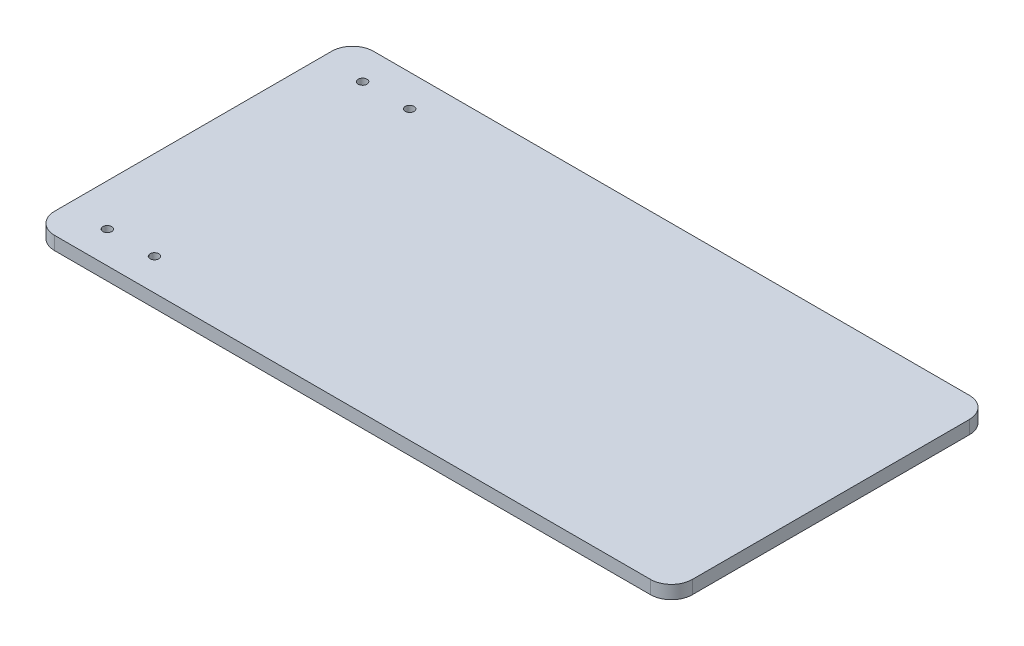
ISO-10303-21;
HEADER;
FILE_DESCRIPTION(('STEP AP214'),'2;1');
FILE_NAME('part.step','',(''),(''),'','','');
FILE_SCHEMA(('AUTOMOTIVE_DESIGN { 1 0 10303 214 1 1 1 1 }'));
ENDSEC;
DATA;
#1=APPLICATION_CONTEXT('core data for automotive mechanical design processes');
#2=APPLICATION_PROTOCOL_DEFINITION('international standard','automotive_design',2000,#1);
#3=PRODUCT_CONTEXT('',#1,'mechanical');
#4=PRODUCT('Part','Part','',(#3));
#5=PRODUCT_RELATED_PRODUCT_CATEGORY('part','',(#4));
#6=PRODUCT_DEFINITION_FORMATION('','',#4);
#7=PRODUCT_DEFINITION_CONTEXT('part definition',#1,'design');
#8=PRODUCT_DEFINITION('design','',#6,#7);
#9=PRODUCT_DEFINITION_SHAPE('','',#8);
#10=(LENGTH_UNIT() NAMED_UNIT(*) SI_UNIT(.MILLI.,.METRE.));
#11=(NAMED_UNIT(*) PLANE_ANGLE_UNIT() SI_UNIT($,.RADIAN.));
#12=(NAMED_UNIT(*) SI_UNIT($,.STERADIAN.) SOLID_ANGLE_UNIT());
#13=UNCERTAINTY_MEASURE_WITH_UNIT(LENGTH_MEASURE(1.E-05),#10,'distance_accuracy_value','');
#14=(GEOMETRIC_REPRESENTATION_CONTEXT(3) GLOBAL_UNCERTAINTY_ASSIGNED_CONTEXT((#13)) GLOBAL_UNIT_ASSIGNED_CONTEXT((#10,
#11,#12)) REPRESENTATION_CONTEXT('',''));
#15=CARTESIAN_POINT('',(0.,0.,0.));
#16=DIRECTION('',(0.,0.,1.));
#17=DIRECTION('',(1.,0.,0.));
#18=AXIS2_PLACEMENT_3D('',#15,#16,#17);
#19=CARTESIAN_POINT('',(-152.4,6.35,-76.2));
#20=DIRECTION('',(1.,0.,0.));
#21=DIRECTION('',(0.,0.,-1.));
#22=AXIS2_PLACEMENT_3D('',#19,#20,#21);
#23=PLANE('',#22);
#24=DIRECTION('',(0.,0.,1.));
#25=VECTOR('',#24,1.);
#26=CARTESIAN_POINT('',(-152.4,6.35,-76.2));
#27=LINE('',#26,#25);
#28=CARTESIAN_POINT('',(-152.4,6.35,-66.2));
#29=VERTEX_POINT('',#28);
#30=CARTESIAN_POINT('',(-152.4,6.35,66.2));
#31=VERTEX_POINT('',#30);
#32=EDGE_CURVE('E121',#29,#31,#27,.T.);
#33=ORIENTED_EDGE('',*,*,#32,.F.);
#34=DIRECTION('',(0.,-1.,0.));
#35=VECTOR('',#34,1.);
#36=CARTESIAN_POINT('',(-152.4,6.35,-66.2));
#37=LINE('',#36,#35);
#38=CARTESIAN_POINT('',(-152.4,0.,-66.2));
#39=VERTEX_POINT('',#38);
#40=EDGE_CURVE('E106',#29,#39,#37,.T.);
#41=ORIENTED_EDGE('',*,*,#40,.T.);
#42=DIRECTION('',(0.,0.,1.));
#43=VECTOR('',#42,1.);
#44=CARTESIAN_POINT('',(-152.4,0.,-76.2));
#45=LINE('',#44,#43);
#46=CARTESIAN_POINT('',(-152.4,0.,66.2));
#47=VERTEX_POINT('',#46);
#48=EDGE_CURVE('E118',#39,#47,#45,.T.);
#49=ORIENTED_EDGE('',*,*,#48,.T.);
#50=DIRECTION('',(0.,-1.,0.));
#51=VECTOR('',#50,1.);
#52=CARTESIAN_POINT('',(-152.4,6.35,66.2));
#53=LINE('',#52,#51);
#54=EDGE_CURVE('E123',#47,#31,#53,.F.);
#55=ORIENTED_EDGE('',*,*,#54,.T.);
#56=EDGE_LOOP('',(#33,#41,#49,#55));
#57=FACE_BOUND('',#56,.T.);
#58=ADVANCED_FACE('F36',(#57),#23,.F.);
#59=CARTESIAN_POINT('',(-152.4,6.35,76.2));
#60=DIRECTION('',(0.,0.,-1.));
#61=DIRECTION('',(-1.,0.,0.));
#62=AXIS2_PLACEMENT_3D('',#59,#60,#61);
#63=PLANE('',#62);
#64=DIRECTION('',(1.,0.,0.));
#65=VECTOR('',#64,1.);
#66=CARTESIAN_POINT('',(-152.4,0.,76.2));
#67=LINE('',#66,#65);
#68=CARTESIAN_POINT('',(-142.4,0.,76.2));
#69=VERTEX_POINT('',#68);
#70=CARTESIAN_POINT('',(142.4,0.,76.2));
#71=VERTEX_POINT('',#70);
#72=EDGE_CURVE('E127',#69,#71,#67,.T.);
#73=ORIENTED_EDGE('',*,*,#72,.T.);
#74=DIRECTION('',(0.,-1.,0.));
#75=VECTOR('',#74,1.);
#76=CARTESIAN_POINT('',(142.4,6.35,76.2));
#77=LINE('',#76,#75);
#78=CARTESIAN_POINT('',(142.4,6.35,76.2));
#79=VERTEX_POINT('',#78);
#80=EDGE_CURVE('E11',#71,#79,#77,.F.);
#81=ORIENTED_EDGE('',*,*,#80,.T.);
#82=DIRECTION('',(1.,0.,0.));
#83=VECTOR('',#82,1.);
#84=CARTESIAN_POINT('',(-152.4,6.35,76.2));
#85=LINE('',#84,#83);
#86=CARTESIAN_POINT('',(-142.4,6.35,76.2));
#87=VERTEX_POINT('',#86);
#88=EDGE_CURVE('E167',#87,#79,#85,.T.);
#89=ORIENTED_EDGE('',*,*,#88,.F.);
#90=DIRECTION('',(0.,-1.,0.));
#91=VECTOR('',#90,1.);
#92=CARTESIAN_POINT('',(-142.4,6.35,76.2));
#93=LINE('',#92,#91);
#94=EDGE_CURVE('E44',#87,#69,#93,.T.);
#95=ORIENTED_EDGE('',*,*,#94,.T.);
#96=EDGE_LOOP('',(#73,#81,#89,#95));
#97=FACE_BOUND('',#96,.T.);
#98=ADVANCED_FACE('F165',(#97),#63,.F.);
#99=CARTESIAN_POINT('',(152.4,6.35,-76.2));
#100=DIRECTION('',(-1.,0.,0.));
#101=DIRECTION('',(0.,0.,1.));
#102=AXIS2_PLACEMENT_3D('',#99,#100,#101);
#103=PLANE('',#102);
#104=DIRECTION('',(0.,0.,-1.));
#105=VECTOR('',#104,1.);
#106=CARTESIAN_POINT('',(152.4,0.,-76.2));
#107=LINE('',#106,#105);
#108=CARTESIAN_POINT('',(152.4,0.,66.2));
#109=VERTEX_POINT('',#108);
#110=CARTESIAN_POINT('',(152.4,0.,-66.2));
#111=VERTEX_POINT('',#110);
#112=EDGE_CURVE('E131',#109,#111,#107,.T.);
#113=ORIENTED_EDGE('',*,*,#112,.T.);
#114=DIRECTION('',(0.,-1.,0.));
#115=VECTOR('',#114,1.);
#116=CARTESIAN_POINT('',(152.4,6.35,-66.2));
#117=LINE('',#116,#115);
#118=CARTESIAN_POINT('',(152.4,6.35,-66.2));
#119=VERTEX_POINT('',#118);
#120=EDGE_CURVE('E51',#111,#119,#117,.F.);
#121=ORIENTED_EDGE('',*,*,#120,.T.);
#122=DIRECTION('',(0.,0.,-1.));
#123=VECTOR('',#122,1.);
#124=CARTESIAN_POINT('',(152.4,6.35,-76.2));
#125=LINE('',#124,#123);
#126=CARTESIAN_POINT('',(152.4,6.35,66.2));
#127=VERTEX_POINT('',#126);
#128=EDGE_CURVE('E175',#127,#119,#125,.T.);
#129=ORIENTED_EDGE('',*,*,#128,.F.);
#130=DIRECTION('',(0.,-1.,0.));
#131=VECTOR('',#130,1.);
#132=CARTESIAN_POINT('',(152.4,6.35,66.2));
#133=LINE('',#132,#131);
#134=EDGE_CURVE('E158',#127,#109,#133,.T.);
#135=ORIENTED_EDGE('',*,*,#134,.T.);
#136=EDGE_LOOP('',(#113,#121,#129,#135));
#137=FACE_BOUND('',#136,.T.);
#138=ADVANCED_FACE('F174',(#137),#103,.F.);
#139=CARTESIAN_POINT('',(-152.4,6.35,-76.2));
#140=DIRECTION('',(0.,0.,1.));
#141=DIRECTION('',(1.,0.,0.));
#142=AXIS2_PLACEMENT_3D('',#139,#140,#141);
#143=PLANE('',#142);
#144=DIRECTION('',(-1.,0.,0.));
#145=VECTOR('',#144,1.);
#146=CARTESIAN_POINT('',(-152.4,0.,-76.2));
#147=LINE('',#146,#145);
#148=CARTESIAN_POINT('',(142.4,0.,-76.2));
#149=VERTEX_POINT('',#148);
#150=CARTESIAN_POINT('',(-142.4,0.,-76.2));
#151=VERTEX_POINT('',#150);
#152=EDGE_CURVE('E141',#149,#151,#147,.T.);
#153=ORIENTED_EDGE('',*,*,#152,.T.);
#154=DIRECTION('',(0.,-1.,0.));
#155=VECTOR('',#154,1.);
#156=CARTESIAN_POINT('',(-142.4,6.35,-76.2));
#157=LINE('',#156,#155);
#158=CARTESIAN_POINT('',(-142.4,6.35,-76.2));
#159=VERTEX_POINT('',#158);
#160=EDGE_CURVE('E107',#151,#159,#157,.F.);
#161=ORIENTED_EDGE('',*,*,#160,.T.);
#162=DIRECTION('',(-1.,0.,0.));
#163=VECTOR('',#162,1.);
#164=CARTESIAN_POINT('',(-152.4,6.35,-76.2));
#165=LINE('',#164,#163);
#166=CARTESIAN_POINT('',(142.4,6.35,-76.2));
#167=VERTEX_POINT('',#166);
#168=EDGE_CURVE('E137',#167,#159,#165,.T.);
#169=ORIENTED_EDGE('',*,*,#168,.F.);
#170=DIRECTION('',(0.,-1.,0.));
#171=VECTOR('',#170,1.);
#172=CARTESIAN_POINT('',(142.4,6.35,-76.2));
#173=LINE('',#172,#171);
#174=EDGE_CURVE('E112',#167,#149,#173,.T.);
#175=ORIENTED_EDGE('',*,*,#174,.T.);
#176=EDGE_LOOP('',(#153,#161,#169,#175));
#177=FACE_BOUND('',#176,.T.);
#178=ADVANCED_FACE('F207',(#177),#143,.F.);
#179=CARTESIAN_POINT('',(0.,6.35,0.));
#180=DIRECTION('',(0.,1.,0.));
#181=DIRECTION('',(0.,0.,1.));
#182=AXIS2_PLACEMENT_3D('',#179,#180,#181);
#183=PLANE('',#182);
#184=CARTESIAN_POINT('',(-132.4,6.35,61.));
#185=DIRECTION('',(0.,1.,0.));
#186=DIRECTION('',(0.,0.,1.));
#187=AXIS2_PLACEMENT_3D('',#184,#185,#186);
#188=CIRCLE('',#187,2.09999999999999);
#189=CARTESIAN_POINT('',(-132.4,6.35,63.1));
#190=VERTEX_POINT('',#189);
#191=EDGE_CURVE('E198',#190,#190,#188,.T.);
#192=ORIENTED_EDGE('',*,*,#191,.F.);
#193=EDGE_LOOP('',(#192));
#194=FACE_BOUND('',#193,.T.);
#195=CARTESIAN_POINT('',(-132.4,6.35,-61.));
#196=DIRECTION('',(0.,1.,0.));
#197=DIRECTION('',(0.,0.,1.));
#198=AXIS2_PLACEMENT_3D('',#195,#196,#197);
#199=CIRCLE('',#198,2.09999999999999);
#200=CARTESIAN_POINT('',(-132.4,6.35,-58.9));
#201=VERTEX_POINT('',#200);
#202=EDGE_CURVE('E192',#201,#201,#199,.T.);
#203=ORIENTED_EDGE('',*,*,#202,.F.);
#204=EDGE_LOOP('',(#203));
#205=FACE_BOUND('',#204,.T.);
#206=CARTESIAN_POINT('',(-109.9,6.35,-61.));
#207=DIRECTION('',(0.,1.,0.));
#208=DIRECTION('',(0.,0.,1.));
#209=AXIS2_PLACEMENT_3D('',#206,#207,#208);
#210=CIRCLE('',#209,2.09999999999999);
#211=CARTESIAN_POINT('',(-109.9,6.35,-58.9));
#212=VERTEX_POINT('',#211);
#213=EDGE_CURVE('E186',#212,#212,#210,.T.);
#214=ORIENTED_EDGE('',*,*,#213,.F.);
#215=EDGE_LOOP('',(#214));
#216=FACE_BOUND('',#215,.T.);
#217=CARTESIAN_POINT('',(-109.9,6.35,61.));
#218=DIRECTION('',(0.,1.,0.));
#219=DIRECTION('',(0.,0.,1.));
#220=AXIS2_PLACEMENT_3D('',#217,#218,#219);
#221=CIRCLE('',#220,2.09999999999999);
#222=CARTESIAN_POINT('',(-109.9,6.35,63.1));
#223=VERTEX_POINT('',#222);
#224=EDGE_CURVE('E134',#223,#223,#221,.T.);
#225=ORIENTED_EDGE('',*,*,#224,.F.);
#226=EDGE_LOOP('',(#225));
#227=FACE_BOUND('',#226,.T.);
#228=ORIENTED_EDGE('',*,*,#168,.T.);
#229=CARTESIAN_POINT('',(-142.4,6.35,-66.2));
#230=DIRECTION('',(0.,1.,0.));
#231=DIRECTION('',(0.,0.,1.));
#232=AXIS2_PLACEMENT_3D('',#229,#230,#231);
#233=CIRCLE('',#232,10.);
#234=EDGE_CURVE('E156',#159,#29,#233,.T.);
#235=ORIENTED_EDGE('',*,*,#234,.T.);
#236=ORIENTED_EDGE('',*,*,#32,.T.);
#237=CARTESIAN_POINT('',(-142.4,6.35,66.2));
#238=DIRECTION('',(0.,1.,0.));
#239=DIRECTION('',(0.,0.,1.));
#240=AXIS2_PLACEMENT_3D('',#237,#238,#239);
#241=CIRCLE('',#240,10.);
#242=EDGE_CURVE('E151',#31,#87,#241,.T.);
#243=ORIENTED_EDGE('',*,*,#242,.T.);
#244=ORIENTED_EDGE('',*,*,#88,.T.);
#245=CARTESIAN_POINT('',(142.4,6.35,66.2));
#246=DIRECTION('',(0.,1.,0.));
#247=DIRECTION('',(0.,0.,1.));
#248=AXIS2_PLACEMENT_3D('',#245,#246,#247);
#249=CIRCLE('',#248,10.);
#250=EDGE_CURVE('E58',#79,#127,#249,.T.);
#251=ORIENTED_EDGE('',*,*,#250,.T.);
#252=ORIENTED_EDGE('',*,*,#128,.T.);
#253=CARTESIAN_POINT('',(142.4,6.35,-66.2));
#254=DIRECTION('',(0.,1.,0.));
#255=DIRECTION('',(0.,0.,1.));
#256=AXIS2_PLACEMENT_3D('',#253,#254,#255);
#257=CIRCLE('',#256,10.);
#258=EDGE_CURVE('E154',#119,#167,#257,.T.);
#259=ORIENTED_EDGE('',*,*,#258,.T.);
#260=EDGE_LOOP('',(#228,#235,#236,#243,#244,#251,#252,#259));
#261=FACE_BOUND('',#260,.T.);
#262=ADVANCED_FACE('F204',(#194,#205,#216,#227,#261),#183,.T.);
#263=CARTESIAN_POINT('',(0.,0.,0.));
#264=DIRECTION('',(0.,1.,0.));
#265=DIRECTION('',(0.,0.,1.));
#266=AXIS2_PLACEMENT_3D('',#263,#264,#265);
#267=PLANE('',#266);
#268=CARTESIAN_POINT('',(-132.4,0.,61.));
#269=DIRECTION('',(0.,1.,0.));
#270=DIRECTION('',(0.,0.,1.));
#271=AXIS2_PLACEMENT_3D('',#268,#269,#270);
#272=CIRCLE('',#271,2.09999999999999);
#273=CARTESIAN_POINT('',(-132.4,0.,63.1));
#274=VERTEX_POINT('',#273);
#275=EDGE_CURVE('E195',#274,#274,#272,.T.);
#276=ORIENTED_EDGE('',*,*,#275,.T.);
#277=EDGE_LOOP('',(#276));
#278=FACE_BOUND('',#277,.T.);
#279=CARTESIAN_POINT('',(-132.4,0.,-61.));
#280=DIRECTION('',(0.,1.,0.));
#281=DIRECTION('',(0.,0.,1.));
#282=AXIS2_PLACEMENT_3D('',#279,#280,#281);
#283=CIRCLE('',#282,2.09999999999999);
#284=CARTESIAN_POINT('',(-132.4,0.,-58.9));
#285=VERTEX_POINT('',#284);
#286=EDGE_CURVE('E189',#285,#285,#283,.T.);
#287=ORIENTED_EDGE('',*,*,#286,.T.);
#288=EDGE_LOOP('',(#287));
#289=FACE_BOUND('',#288,.T.);
#290=CARTESIAN_POINT('',(-109.9,0.,-61.));
#291=DIRECTION('',(0.,1.,0.));
#292=DIRECTION('',(0.,0.,1.));
#293=AXIS2_PLACEMENT_3D('',#290,#291,#292);
#294=CIRCLE('',#293,2.09999999999999);
#295=CARTESIAN_POINT('',(-109.9,0.,-58.9));
#296=VERTEX_POINT('',#295);
#297=EDGE_CURVE('E183',#296,#296,#294,.T.);
#298=ORIENTED_EDGE('',*,*,#297,.T.);
#299=EDGE_LOOP('',(#298));
#300=FACE_BOUND('',#299,.T.);
#301=CARTESIAN_POINT('',(-109.9,0.,61.));
#302=DIRECTION('',(0.,1.,0.));
#303=DIRECTION('',(0.,0.,1.));
#304=AXIS2_PLACEMENT_3D('',#301,#302,#303);
#305=CIRCLE('',#304,2.09999999999999);
#306=CARTESIAN_POINT('',(-109.9,0.,63.1));
#307=VERTEX_POINT('',#306);
#308=EDGE_CURVE('E128',#307,#307,#305,.T.);
#309=ORIENTED_EDGE('',*,*,#308,.T.);
#310=EDGE_LOOP('',(#309));
#311=FACE_BOUND('',#310,.T.);
#312=ORIENTED_EDGE('',*,*,#48,.F.);
#313=CARTESIAN_POINT('',(-142.4,0.,-66.2));
#314=DIRECTION('',(0.,1.,0.));
#315=DIRECTION('',(0.,0.,1.));
#316=AXIS2_PLACEMENT_3D('',#313,#314,#315);
#317=CIRCLE('',#316,10.);
#318=EDGE_CURVE('E102',#39,#151,#317,.F.);
#319=ORIENTED_EDGE('',*,*,#318,.T.);
#320=ORIENTED_EDGE('',*,*,#152,.F.);
#321=CARTESIAN_POINT('',(142.4,0.,-66.2));
#322=DIRECTION('',(0.,1.,0.));
#323=DIRECTION('',(0.,0.,1.));
#324=AXIS2_PLACEMENT_3D('',#321,#322,#323);
#325=CIRCLE('',#324,10.);
#326=EDGE_CURVE('E113',#149,#111,#325,.F.);
#327=ORIENTED_EDGE('',*,*,#326,.T.);
#328=ORIENTED_EDGE('',*,*,#112,.F.);
#329=CARTESIAN_POINT('',(142.4,0.,66.2));
#330=DIRECTION('',(0.,1.,0.));
#331=DIRECTION('',(0.,0.,1.));
#332=AXIS2_PLACEMENT_3D('',#329,#330,#331);
#333=CIRCLE('',#332,10.);
#334=EDGE_CURVE('E145',#109,#71,#333,.F.);
#335=ORIENTED_EDGE('',*,*,#334,.T.);
#336=ORIENTED_EDGE('',*,*,#72,.F.);
#337=CARTESIAN_POINT('',(-142.4,0.,66.2));
#338=DIRECTION('',(0.,1.,0.));
#339=DIRECTION('',(0.,0.,1.));
#340=AXIS2_PLACEMENT_3D('',#337,#338,#339);
#341=CIRCLE('',#340,10.);
#342=EDGE_CURVE('E122',#69,#47,#341,.F.);
#343=ORIENTED_EDGE('',*,*,#342,.T.);
#344=EDGE_LOOP('',(#312,#319,#320,#327,#328,#335,#336,#343));
#345=FACE_BOUND('',#344,.T.);
#346=ADVANCED_FACE('F125',(#278,#289,#300,#311,#345),#267,.F.);
#347=CARTESIAN_POINT('',(-142.4,6.35,-66.2));
#348=DIRECTION('',(0.,-1.,0.));
#349=DIRECTION('',(0.,0.,-1.));
#350=AXIS2_PLACEMENT_3D('',#347,#348,#349);
#351=CYLINDRICAL_SURFACE('',#350,10.);
#352=ORIENTED_EDGE('',*,*,#234,.F.);
#353=ORIENTED_EDGE('',*,*,#160,.F.);
#354=ORIENTED_EDGE('',*,*,#318,.F.);
#355=ORIENTED_EDGE('',*,*,#40,.F.);
#356=EDGE_LOOP('',(#352,#353,#354,#355));
#357=FACE_BOUND('',#356,.T.);
#358=ADVANCED_FACE('F105',(#357),#351,.T.);
#359=CARTESIAN_POINT('',(142.4,6.35,-66.2));
#360=DIRECTION('',(0.,-1.,0.));
#361=DIRECTION('',(0.,0.,-1.));
#362=AXIS2_PLACEMENT_3D('',#359,#360,#361);
#363=CYLINDRICAL_SURFACE('',#362,10.);
#364=ORIENTED_EDGE('',*,*,#258,.F.);
#365=ORIENTED_EDGE('',*,*,#120,.F.);
#366=ORIENTED_EDGE('',*,*,#326,.F.);
#367=ORIENTED_EDGE('',*,*,#174,.F.);
#368=EDGE_LOOP('',(#364,#365,#366,#367));
#369=FACE_BOUND('',#368,.T.);
#370=ADVANCED_FACE('F218',(#369),#363,.T.);
#371=CARTESIAN_POINT('',(142.4,6.35,66.2));
#372=DIRECTION('',(0.,-1.,0.));
#373=DIRECTION('',(0.,0.,-1.));
#374=AXIS2_PLACEMENT_3D('',#371,#372,#373);
#375=CYLINDRICAL_SURFACE('',#374,10.);
#376=ORIENTED_EDGE('',*,*,#250,.F.);
#377=ORIENTED_EDGE('',*,*,#80,.F.);
#378=ORIENTED_EDGE('',*,*,#334,.F.);
#379=ORIENTED_EDGE('',*,*,#134,.F.);
#380=EDGE_LOOP('',(#376,#377,#378,#379));
#381=FACE_BOUND('',#380,.T.);
#382=ADVANCED_FACE('F173',(#381),#375,.T.);
#383=CARTESIAN_POINT('',(-142.4,6.35,66.2));
#384=DIRECTION('',(0.,-1.,0.));
#385=DIRECTION('',(0.,0.,-1.));
#386=AXIS2_PLACEMENT_3D('',#383,#384,#385);
#387=CYLINDRICAL_SURFACE('',#386,10.);
#388=ORIENTED_EDGE('',*,*,#242,.F.);
#389=ORIENTED_EDGE('',*,*,#54,.F.);
#390=ORIENTED_EDGE('',*,*,#342,.F.);
#391=ORIENTED_EDGE('',*,*,#94,.F.);
#392=EDGE_LOOP('',(#388,#389,#390,#391));
#393=FACE_BOUND('',#392,.T.);
#394=ADVANCED_FACE('F38',(#393),#387,.T.);
#395=CARTESIAN_POINT('',(-109.9,6.35,61.));
#396=DIRECTION('',(0.,1.,0.));
#397=DIRECTION('',(0.,0.,1.));
#398=AXIS2_PLACEMENT_3D('',#395,#396,#397);
#399=CYLINDRICAL_SURFACE('',#398,2.09999999999999);
#400=ORIENTED_EDGE('',*,*,#308,.F.);
#401=EDGE_LOOP('',(#400));
#402=FACE_BOUND('',#401,.T.);
#403=ORIENTED_EDGE('',*,*,#224,.T.);
#404=EDGE_LOOP('',(#403));
#405=FACE_BOUND('',#404,.T.);
#406=ADVANCED_FACE('F240',(#402,#405),#399,.F.);
#407=CARTESIAN_POINT('',(-109.9,6.35,-61.));
#408=DIRECTION('',(0.,1.,0.));
#409=DIRECTION('',(0.,0.,1.));
#410=AXIS2_PLACEMENT_3D('',#407,#408,#409);
#411=CYLINDRICAL_SURFACE('',#410,2.09999999999999);
#412=ORIENTED_EDGE('',*,*,#297,.F.);
#413=EDGE_LOOP('',(#412));
#414=FACE_BOUND('',#413,.T.);
#415=ORIENTED_EDGE('',*,*,#213,.T.);
#416=EDGE_LOOP('',(#415));
#417=FACE_BOUND('',#416,.T.);
#418=ADVANCED_FACE('F243',(#414,#417),#411,.F.);
#419=CARTESIAN_POINT('',(-132.4,6.35,-61.));
#420=DIRECTION('',(0.,1.,0.));
#421=DIRECTION('',(0.,0.,1.));
#422=AXIS2_PLACEMENT_3D('',#419,#420,#421);
#423=CYLINDRICAL_SURFACE('',#422,2.09999999999999);
#424=ORIENTED_EDGE('',*,*,#286,.F.);
#425=EDGE_LOOP('',(#424));
#426=FACE_BOUND('',#425,.T.);
#427=ORIENTED_EDGE('',*,*,#202,.T.);
#428=EDGE_LOOP('',(#427));
#429=FACE_BOUND('',#428,.T.);
#430=ADVANCED_FACE('F247',(#426,#429),#423,.F.);
#431=CARTESIAN_POINT('',(-132.4,6.35,61.));
#432=DIRECTION('',(0.,1.,0.));
#433=DIRECTION('',(0.,0.,1.));
#434=AXIS2_PLACEMENT_3D('',#431,#432,#433);
#435=CYLINDRICAL_SURFACE('',#434,2.09999999999999);
#436=ORIENTED_EDGE('',*,*,#275,.F.);
#437=EDGE_LOOP('',(#436));
#438=FACE_BOUND('',#437,.T.);
#439=ORIENTED_EDGE('',*,*,#191,.T.);
#440=EDGE_LOOP('',(#439));
#441=FACE_BOUND('',#440,.T.);
#442=ADVANCED_FACE('F202',(#438,#441),#435,.F.);
#443=CLOSED_SHELL('',(#58,#98,#138,#178,#262,#346,#358,#370,#382,#394,#406,#418,#430,#442));
#444=MANIFOLD_SOLID_BREP('B2',#443);
#445=ADVANCED_BREP_SHAPE_REPRESENTATION('',(#18,#444),#14);
#446=SHAPE_DEFINITION_REPRESENTATION(#9,#445);
ENDSEC;
END-ISO-10303-21;
